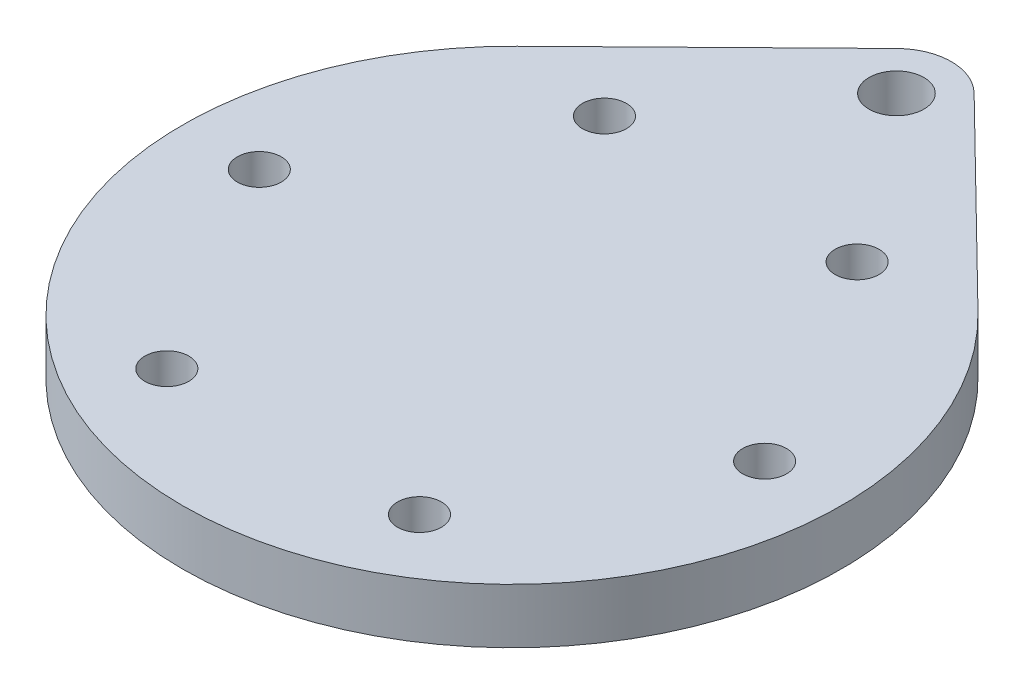
ISO-10303-21;
HEADER;
FILE_DESCRIPTION(('STEP AP214'),'2;1');
FILE_NAME('part.step','',(''),(''),'','','');
FILE_SCHEMA(('AUTOMOTIVE_DESIGN { 1 0 10303 214 1 1 1 1 }'));
ENDSEC;
DATA;
#1=APPLICATION_CONTEXT('core data for automotive mechanical design processes');
#2=APPLICATION_PROTOCOL_DEFINITION('international standard','automotive_design',2000,#1);
#3=PRODUCT_CONTEXT('',#1,'mechanical');
#4=PRODUCT('Part','Part','',(#3));
#5=PRODUCT_RELATED_PRODUCT_CATEGORY('part','',(#4));
#6=PRODUCT_DEFINITION_FORMATION('','',#4);
#7=PRODUCT_DEFINITION_CONTEXT('part definition',#1,'design');
#8=PRODUCT_DEFINITION('design','',#6,#7);
#9=PRODUCT_DEFINITION_SHAPE('','',#8);
#10=(LENGTH_UNIT() NAMED_UNIT(*) SI_UNIT(.MILLI.,.METRE.));
#11=(NAMED_UNIT(*) PLANE_ANGLE_UNIT() SI_UNIT($,.RADIAN.));
#12=(NAMED_UNIT(*) SI_UNIT($,.STERADIAN.) SOLID_ANGLE_UNIT());
#13=UNCERTAINTY_MEASURE_WITH_UNIT(LENGTH_MEASURE(1.E-05),#10,'distance_accuracy_value','');
#14=(GEOMETRIC_REPRESENTATION_CONTEXT(3) GLOBAL_UNCERTAINTY_ASSIGNED_CONTEXT((#13)) GLOBAL_UNIT_ASSIGNED_CONTEXT((#10,
#11,#12)) REPRESENTATION_CONTEXT('',''));
#15=CARTESIAN_POINT('',(0.,0.,0.));
#16=DIRECTION('',(0.,0.,1.));
#17=DIRECTION('',(1.,0.,0.));
#18=AXIS2_PLACEMENT_3D('',#15,#16,#17);
#19=CARTESIAN_POINT('',(0.,5.,0.));
#20=DIRECTION('',(0.,-1.,0.));
#21=DIRECTION('',(0.,0.,-1.));
#22=AXIS2_PLACEMENT_3D('',#19,#20,#21);
#23=CYLINDRICAL_SURFACE('',#22,30.);
#24=CARTESIAN_POINT('',(0.,0.,0.));
#25=DIRECTION('',(0.,1.,0.));
#26=DIRECTION('',(0.,0.,1.));
#27=AXIS2_PLACEMENT_3D('',#24,#25,#26);
#28=CIRCLE('',#27,30.);
#29=CARTESIAN_POINT('',(-20.995626366713,0.,-21.4285714285714));
#30=VERTEX_POINT('',#29);
#31=CARTESIAN_POINT('',(20.995626366713,0.,-21.4285714285714));
#32=VERTEX_POINT('',#31);
#33=EDGE_CURVE('E123',#30,#32,#28,.T.);
#34=ORIENTED_EDGE('',*,*,#33,.T.);
#35=DIRECTION('',(0.,-1.,0.));
#36=VECTOR('',#35,1.);
#37=CARTESIAN_POINT('',(20.995626366713,5.,-21.4285714285714));
#38=LINE('',#37,#36);
#39=CARTESIAN_POINT('',(20.995626366713,5.,-21.4285714285714));
#40=VERTEX_POINT('',#39);
#41=EDGE_CURVE('E11',#40,#32,#38,.T.);
#42=ORIENTED_EDGE('',*,*,#41,.F.);
#43=CARTESIAN_POINT('',(0.,5.,0.));
#44=DIRECTION('',(0.,1.,0.));
#45=DIRECTION('',(0.,0.,1.));
#46=AXIS2_PLACEMENT_3D('',#43,#44,#45);
#47=CIRCLE('',#46,30.);
#48=CARTESIAN_POINT('',(-20.995626366713,5.,-21.4285714285714));
#49=VERTEX_POINT('',#48);
#50=EDGE_CURVE('E78',#49,#40,#47,.T.);
#51=ORIENTED_EDGE('',*,*,#50,.F.);
#52=DIRECTION('',(0.,-1.,0.));
#53=VECTOR('',#52,1.);
#54=CARTESIAN_POINT('',(-20.995626366713,5.,-21.4285714285714));
#55=LINE('',#54,#53);
#56=EDGE_CURVE('E104',#49,#30,#55,.T.);
#57=ORIENTED_EDGE('',*,*,#56,.T.);
#58=EDGE_LOOP('',(#34,#42,#51,#57));
#59=FACE_BOUND('',#58,.T.);
#60=ADVANCED_FACE('F35',(#59),#23,.T.);
#61=CARTESIAN_POINT('',(20.995626366713,5.,-21.4285714285714));
#62=DIRECTION('',(0.699854212223765,0.,-0.714285714285714));
#63=DIRECTION('',(-0.714285714285714,0.,-0.699854212223765));
#64=AXIS2_PLACEMENT_3D('',#61,#62,#63);
#65=PLANE('',#64);
#66=DIRECTION('',(0.714285714285714,0.,0.699854212223766));
#67=VECTOR('',#66,1.);
#68=CARTESIAN_POINT('',(20.995626366713,0.,-21.4285714285714));
#69=LINE('',#68,#67);
#70=CARTESIAN_POINT('',(3.49927106111883,0.,-38.5714285714286));
#71=VERTEX_POINT('',#70);
#72=EDGE_CURVE('E88',#71,#32,#69,.T.);
#73=ORIENTED_EDGE('',*,*,#72,.F.);
#74=DIRECTION('',(0.,-1.,0.));
#75=VECTOR('',#74,1.);
#76=CARTESIAN_POINT('',(3.49927106111883,5.,-38.5714285714286));
#77=LINE('',#76,#75);
#78=CARTESIAN_POINT('',(3.49927106111883,5.,-38.5714285714286));
#79=VERTEX_POINT('',#78);
#80=EDGE_CURVE('E44',#79,#71,#77,.T.);
#81=ORIENTED_EDGE('',*,*,#80,.F.);
#82=DIRECTION('',(0.714285714285714,0.,0.699854212223766));
#83=VECTOR('',#82,1.);
#84=CARTESIAN_POINT('',(20.995626366713,5.,-21.4285714285714));
#85=LINE('',#84,#83);
#86=EDGE_CURVE('E86',#79,#40,#85,.T.);
#87=ORIENTED_EDGE('',*,*,#86,.T.);
#88=ORIENTED_EDGE('',*,*,#41,.T.);
#89=EDGE_LOOP('',(#73,#81,#87,#88));
#90=FACE_BOUND('',#89,.T.);
#91=ADVANCED_FACE('F85',(#90),#65,.T.);
#92=CARTESIAN_POINT('',(0.,5.,-35.));
#93=DIRECTION('',(0.,-1.,0.));
#94=DIRECTION('',(0.,0.,-1.));
#95=AXIS2_PLACEMENT_3D('',#92,#93,#94);
#96=CYLINDRICAL_SURFACE('',#95,5.00000000000001);
#97=CARTESIAN_POINT('',(0.,0.,-35.));
#98=DIRECTION('',(0.,1.,0.));
#99=DIRECTION('',(0.,0.,1.));
#100=AXIS2_PLACEMENT_3D('',#97,#98,#99);
#101=CIRCLE('',#100,5.00000000000001);
#102=CARTESIAN_POINT('',(-3.49927106111883,0.,-38.5714285714286));
#103=VERTEX_POINT('',#102);
#104=EDGE_CURVE('E67',#71,#103,#101,.T.);
#105=ORIENTED_EDGE('',*,*,#104,.T.);
#106=DIRECTION('',(0.,-1.,0.));
#107=VECTOR('',#106,1.);
#108=CARTESIAN_POINT('',(-3.49927106111883,5.,-38.5714285714286));
#109=LINE('',#108,#107);
#110=CARTESIAN_POINT('',(-3.49927106111883,5.,-38.5714285714286));
#111=VERTEX_POINT('',#110);
#112=EDGE_CURVE('E89',#111,#103,#109,.T.);
#113=ORIENTED_EDGE('',*,*,#112,.F.);
#114=CARTESIAN_POINT('',(0.,5.,-35.));
#115=DIRECTION('',(0.,1.,0.));
#116=DIRECTION('',(0.,0.,1.));
#117=AXIS2_PLACEMENT_3D('',#114,#115,#116);
#118=CIRCLE('',#117,5.00000000000001);
#119=EDGE_CURVE('E90',#79,#111,#118,.T.);
#120=ORIENTED_EDGE('',*,*,#119,.F.);
#121=ORIENTED_EDGE('',*,*,#80,.T.);
#122=EDGE_LOOP('',(#105,#113,#120,#121));
#123=FACE_BOUND('',#122,.T.);
#124=ADVANCED_FACE('F91',(#123),#96,.T.);
#125=CARTESIAN_POINT('',(-20.995626366713,5.,-21.4285714285714));
#126=DIRECTION('',(0.699854212223765,0.,0.714285714285714));
#127=DIRECTION('',(0.714285714285714,0.,-0.699854212223765));
#128=AXIS2_PLACEMENT_3D('',#125,#126,#127);
#129=PLANE('',#128);
#130=DIRECTION('',(-0.714285714285714,0.,0.699854212223765));
#131=VECTOR('',#130,1.);
#132=CARTESIAN_POINT('',(-20.995626366713,0.,-21.4285714285714));
#133=LINE('',#132,#131);
#134=EDGE_CURVE('E73',#103,#30,#133,.T.);
#135=ORIENTED_EDGE('',*,*,#134,.T.);
#136=ORIENTED_EDGE('',*,*,#56,.F.);
#137=DIRECTION('',(-0.714285714285714,0.,0.699854212223765));
#138=VECTOR('',#137,1.);
#139=CARTESIAN_POINT('',(-20.995626366713,5.,-21.4285714285714));
#140=LINE('',#139,#138);
#141=EDGE_CURVE('E52',#111,#49,#140,.T.);
#142=ORIENTED_EDGE('',*,*,#141,.F.);
#143=ORIENTED_EDGE('',*,*,#112,.T.);
#144=EDGE_LOOP('',(#135,#136,#142,#143));
#145=FACE_BOUND('',#144,.T.);
#146=ADVANCED_FACE('F134',(#145),#129,.F.);
#147=CARTESIAN_POINT('',(23.,5.,0.));
#148=DIRECTION('',(0.,-1.,0.));
#149=DIRECTION('',(0.,0.,-1.));
#150=AXIS2_PLACEMENT_3D('',#147,#148,#149);
#151=CYLINDRICAL_SURFACE('',#150,2.);
#152=CARTESIAN_POINT('',(23.,5.,0.));
#153=DIRECTION('',(0.,1.,0.));
#154=DIRECTION('',(0.,0.,1.));
#155=AXIS2_PLACEMENT_3D('',#152,#153,#154);
#156=CIRCLE('',#155,2.);
#157=CARTESIAN_POINT('',(23.,5.,2.));
#158=VERTEX_POINT('',#157);
#159=EDGE_CURVE('E96',#158,#158,#156,.T.);
#160=ORIENTED_EDGE('',*,*,#159,.T.);
#161=EDGE_LOOP('',(#160));
#162=FACE_BOUND('',#161,.T.);
#163=CARTESIAN_POINT('',(23.,0.,0.));
#164=DIRECTION('',(0.,1.,0.));
#165=DIRECTION('',(0.,0.,1.));
#166=AXIS2_PLACEMENT_3D('',#163,#164,#165);
#167=CIRCLE('',#166,2.);
#168=CARTESIAN_POINT('',(23.,0.,2.));
#169=VERTEX_POINT('',#168);
#170=EDGE_CURVE('E120',#169,#169,#167,.T.);
#171=ORIENTED_EDGE('',*,*,#170,.F.);
#172=EDGE_LOOP('',(#171));
#173=FACE_BOUND('',#172,.T.);
#174=ADVANCED_FACE('F148',(#162,#173),#151,.F.);
#175=CARTESIAN_POINT('',(11.5,5.,19.9185842870421));
#176=DIRECTION('',(0.,-1.,0.));
#177=DIRECTION('',(0.,0.,-1.));
#178=AXIS2_PLACEMENT_3D('',#175,#176,#177);
#179=CYLINDRICAL_SURFACE('',#178,2.);
#180=CARTESIAN_POINT('',(11.5,5.,19.9185842870421));
#181=DIRECTION('',(0.,1.,0.));
#182=DIRECTION('',(0.,0.,1.));
#183=AXIS2_PLACEMENT_3D('',#180,#181,#182);
#184=CIRCLE('',#183,2.);
#185=CARTESIAN_POINT('',(11.5,5.,21.9185842870421));
#186=VERTEX_POINT('',#185);
#187=EDGE_CURVE('E313',#186,#186,#184,.T.);
#188=ORIENTED_EDGE('',*,*,#187,.T.);
#189=EDGE_LOOP('',(#188));
#190=FACE_BOUND('',#189,.T.);
#191=CARTESIAN_POINT('',(11.5,0.,19.9185842870421));
#192=DIRECTION('',(0.,1.,0.));
#193=DIRECTION('',(0.,0.,1.));
#194=AXIS2_PLACEMENT_3D('',#191,#192,#193);
#195=CIRCLE('',#194,2.);
#196=CARTESIAN_POINT('',(11.5,0.,21.9185842870421));
#197=VERTEX_POINT('',#196);
#198=EDGE_CURVE('E117',#197,#197,#195,.T.);
#199=ORIENTED_EDGE('',*,*,#198,.F.);
#200=EDGE_LOOP('',(#199));
#201=FACE_BOUND('',#200,.T.);
#202=ADVANCED_FACE('F151',(#190,#201),#179,.F.);
#203=CARTESIAN_POINT('',(-11.5000000000001,5.,19.918584287042));
#204=DIRECTION('',(0.,-1.,0.));
#205=DIRECTION('',(0.,0.,-1.));
#206=AXIS2_PLACEMENT_3D('',#203,#204,#205);
#207=CYLINDRICAL_SURFACE('',#206,2.00000000000001);
#208=CARTESIAN_POINT('',(-11.5000000000001,5.,19.918584287042));
#209=DIRECTION('',(0.,1.,0.));
#210=DIRECTION('',(0.,0.,1.));
#211=AXIS2_PLACEMENT_3D('',#208,#209,#210);
#212=CIRCLE('',#211,2.00000000000001);
#213=CARTESIAN_POINT('',(-11.5000000000001,5.,21.9185842870421));
#214=VERTEX_POINT('',#213);
#215=EDGE_CURVE('E309',#214,#214,#212,.T.);
#216=ORIENTED_EDGE('',*,*,#215,.T.);
#217=EDGE_LOOP('',(#216));
#218=FACE_BOUND('',#217,.T.);
#219=CARTESIAN_POINT('',(-11.5000000000001,0.,19.918584287042));
#220=DIRECTION('',(0.,1.,0.));
#221=DIRECTION('',(0.,0.,1.));
#222=AXIS2_PLACEMENT_3D('',#219,#220,#221);
#223=CIRCLE('',#222,2.00000000000001);
#224=CARTESIAN_POINT('',(-11.5000000000001,0.,21.9185842870421));
#225=VERTEX_POINT('',#224);
#226=EDGE_CURVE('E114',#225,#225,#223,.T.);
#227=ORIENTED_EDGE('',*,*,#226,.F.);
#228=EDGE_LOOP('',(#227));
#229=FACE_BOUND('',#228,.T.);
#230=ADVANCED_FACE('F155',(#218,#229),#207,.F.);
#231=CARTESIAN_POINT('',(-23.,5.,-1.60608141586784E-13));
#232=DIRECTION('',(0.,-1.,0.));
#233=DIRECTION('',(0.,0.,-1.));
#234=AXIS2_PLACEMENT_3D('',#231,#232,#233);
#235=CYLINDRICAL_SURFACE('',#234,2.);
#236=CARTESIAN_POINT('',(-23.,5.,-1.60608141586784E-13));
#237=DIRECTION('',(0.,1.,0.));
#238=DIRECTION('',(0.,0.,1.));
#239=AXIS2_PLACEMENT_3D('',#236,#237,#238);
#240=CIRCLE('',#239,2.);
#241=CARTESIAN_POINT('',(-23.,5.,1.99999999999984));
#242=VERTEX_POINT('',#241);
#243=EDGE_CURVE('E305',#242,#242,#240,.T.);
#244=ORIENTED_EDGE('',*,*,#243,.T.);
#245=EDGE_LOOP('',(#244));
#246=FACE_BOUND('',#245,.T.);
#247=CARTESIAN_POINT('',(-23.,0.,-1.60608141586784E-13));
#248=DIRECTION('',(0.,1.,0.));
#249=DIRECTION('',(0.,0.,1.));
#250=AXIS2_PLACEMENT_3D('',#247,#248,#249);
#251=CIRCLE('',#250,2.);
#252=CARTESIAN_POINT('',(-23.,0.,1.99999999999984));
#253=VERTEX_POINT('',#252);
#254=EDGE_CURVE('E111',#253,#253,#251,.T.);
#255=ORIENTED_EDGE('',*,*,#254,.F.);
#256=EDGE_LOOP('',(#255));
#257=FACE_BOUND('',#256,.T.);
#258=ADVANCED_FACE('F159',(#246,#257),#235,.F.);
#259=CARTESIAN_POINT('',(-11.4999999999998,5.,-19.9185842870422));
#260=DIRECTION('',(0.,-1.,0.));
#261=DIRECTION('',(0.,0.,-1.));
#262=AXIS2_PLACEMENT_3D('',#259,#260,#261);
#263=CYLINDRICAL_SURFACE('',#262,2.);
#264=CARTESIAN_POINT('',(-11.4999999999998,5.,-19.9185842870422));
#265=DIRECTION('',(0.,1.,0.));
#266=DIRECTION('',(0.,0.,1.));
#267=AXIS2_PLACEMENT_3D('',#264,#265,#266);
#268=CIRCLE('',#267,2.);
#269=CARTESIAN_POINT('',(-11.4999999999998,5.,-17.9185842870422));
#270=VERTEX_POINT('',#269);
#271=EDGE_CURVE('E174',#270,#270,#268,.T.);
#272=ORIENTED_EDGE('',*,*,#271,.T.);
#273=EDGE_LOOP('',(#272));
#274=FACE_BOUND('',#273,.T.);
#275=CARTESIAN_POINT('',(-11.4999999999998,0.,-19.9185842870422));
#276=DIRECTION('',(0.,1.,0.));
#277=DIRECTION('',(0.,0.,1.));
#278=AXIS2_PLACEMENT_3D('',#275,#276,#277);
#279=CIRCLE('',#278,2.);
#280=CARTESIAN_POINT('',(-11.4999999999998,0.,-17.9185842870422));
#281=VERTEX_POINT('',#280);
#282=EDGE_CURVE('E108',#281,#281,#279,.T.);
#283=ORIENTED_EDGE('',*,*,#282,.F.);
#284=EDGE_LOOP('',(#283));
#285=FACE_BOUND('',#284,.T.);
#286=ADVANCED_FACE('F162',(#274,#285),#263,.F.);
#287=CARTESIAN_POINT('',(11.5000000000002,5.,-19.918584287042));
#288=DIRECTION('',(0.,-1.,0.));
#289=DIRECTION('',(0.,0.,-1.));
#290=AXIS2_PLACEMENT_3D('',#287,#288,#289);
#291=CYLINDRICAL_SURFACE('',#290,2.);
#292=CARTESIAN_POINT('',(11.5000000000002,5.,-19.918584287042));
#293=DIRECTION('',(0.,1.,0.));
#294=DIRECTION('',(0.,0.,1.));
#295=AXIS2_PLACEMENT_3D('',#292,#293,#294);
#296=CIRCLE('',#295,2.);
#297=CARTESIAN_POINT('',(11.5000000000002,5.,-17.918584287042));
#298=VERTEX_POINT('',#297);
#299=EDGE_CURVE('E132',#298,#298,#296,.T.);
#300=ORIENTED_EDGE('',*,*,#299,.T.);
#301=EDGE_LOOP('',(#300));
#302=FACE_BOUND('',#301,.T.);
#303=CARTESIAN_POINT('',(11.5000000000002,0.,-19.918584287042));
#304=DIRECTION('',(0.,1.,0.));
#305=DIRECTION('',(0.,0.,1.));
#306=AXIS2_PLACEMENT_3D('',#303,#304,#305);
#307=CIRCLE('',#306,2.);
#308=CARTESIAN_POINT('',(11.5000000000002,0.,-17.918584287042));
#309=VERTEX_POINT('',#308);
#310=EDGE_CURVE('E105',#309,#309,#307,.T.);
#311=ORIENTED_EDGE('',*,*,#310,.F.);
#312=EDGE_LOOP('',(#311));
#313=FACE_BOUND('',#312,.T.);
#314=ADVANCED_FACE('F37',(#302,#313),#291,.F.);
#315=CARTESIAN_POINT('',(0.,5.,-35.));
#316=DIRECTION('',(0.,-1.,0.));
#317=DIRECTION('',(0.,0.,-1.));
#318=AXIS2_PLACEMENT_3D('',#315,#316,#317);
#319=CYLINDRICAL_SURFACE('',#318,2.5);
#320=CARTESIAN_POINT('',(0.,5.,-35.));
#321=DIRECTION('',(0.,1.,0.));
#322=DIRECTION('',(0.,0.,1.));
#323=AXIS2_PLACEMENT_3D('',#320,#321,#322);
#324=CIRCLE('',#323,2.5);
#325=CARTESIAN_POINT('',(0.,5.,-32.5));
#326=VERTEX_POINT('',#325);
#327=EDGE_CURVE('E101',#326,#326,#324,.T.);
#328=ORIENTED_EDGE('',*,*,#327,.T.);
#329=EDGE_LOOP('',(#328));
#330=FACE_BOUND('',#329,.T.);
#331=CARTESIAN_POINT('',(0.,0.,-35.));
#332=DIRECTION('',(0.,1.,0.));
#333=DIRECTION('',(0.,0.,1.));
#334=AXIS2_PLACEMENT_3D('',#331,#332,#333);
#335=CIRCLE('',#334,2.5);
#336=CARTESIAN_POINT('',(0.,0.,-32.5));
#337=VERTEX_POINT('',#336);
#338=EDGE_CURVE('E129',#337,#337,#335,.T.);
#339=ORIENTED_EDGE('',*,*,#338,.F.);
#340=EDGE_LOOP('',(#339));
#341=FACE_BOUND('',#340,.T.);
#342=ADVANCED_FACE('F169',(#330,#341),#319,.F.);
#343=CARTESIAN_POINT('',(0.,5.,0.));
#344=DIRECTION('',(0.,1.,0.));
#345=DIRECTION('',(0.,0.,1.));
#346=AXIS2_PLACEMENT_3D('',#343,#344,#345);
#347=PLANE('',#346);
#348=ORIENTED_EDGE('',*,*,#299,.F.);
#349=EDGE_LOOP('',(#348));
#350=FACE_BOUND('',#349,.T.);
#351=ORIENTED_EDGE('',*,*,#271,.F.);
#352=EDGE_LOOP('',(#351));
#353=FACE_BOUND('',#352,.T.);
#354=ORIENTED_EDGE('',*,*,#243,.F.);
#355=EDGE_LOOP('',(#354));
#356=FACE_BOUND('',#355,.T.);
#357=ORIENTED_EDGE('',*,*,#215,.F.);
#358=EDGE_LOOP('',(#357));
#359=FACE_BOUND('',#358,.T.);
#360=ORIENTED_EDGE('',*,*,#187,.F.);
#361=EDGE_LOOP('',(#360));
#362=FACE_BOUND('',#361,.T.);
#363=ORIENTED_EDGE('',*,*,#159,.F.);
#364=EDGE_LOOP('',(#363));
#365=FACE_BOUND('',#364,.T.);
#366=ORIENTED_EDGE('',*,*,#50,.T.);
#367=ORIENTED_EDGE('',*,*,#86,.F.);
#368=ORIENTED_EDGE('',*,*,#119,.T.);
#369=ORIENTED_EDGE('',*,*,#141,.T.);
#370=EDGE_LOOP('',(#366,#367,#368,#369));
#371=FACE_BOUND('',#370,.T.);
#372=ORIENTED_EDGE('',*,*,#327,.F.);
#373=EDGE_LOOP('',(#372));
#374=FACE_BOUND('',#373,.T.);
#375=ADVANCED_FACE('F93',(#350,#353,#356,#359,#362,#365,#371,#374),#347,.T.);
#376=CARTESIAN_POINT('',(0.,0.,0.));
#377=DIRECTION('',(0.,1.,0.));
#378=DIRECTION('',(0.,0.,1.));
#379=AXIS2_PLACEMENT_3D('',#376,#377,#378);
#380=PLANE('',#379);
#381=ORIENTED_EDGE('',*,*,#310,.T.);
#382=EDGE_LOOP('',(#381));
#383=FACE_BOUND('',#382,.T.);
#384=ORIENTED_EDGE('',*,*,#282,.T.);
#385=EDGE_LOOP('',(#384));
#386=FACE_BOUND('',#385,.T.);
#387=ORIENTED_EDGE('',*,*,#254,.T.);
#388=EDGE_LOOP('',(#387));
#389=FACE_BOUND('',#388,.T.);
#390=ORIENTED_EDGE('',*,*,#226,.T.);
#391=EDGE_LOOP('',(#390));
#392=FACE_BOUND('',#391,.T.);
#393=ORIENTED_EDGE('',*,*,#198,.T.);
#394=EDGE_LOOP('',(#393));
#395=FACE_BOUND('',#394,.T.);
#396=ORIENTED_EDGE('',*,*,#170,.T.);
#397=EDGE_LOOP('',(#396));
#398=FACE_BOUND('',#397,.T.);
#399=ORIENTED_EDGE('',*,*,#33,.F.);
#400=ORIENTED_EDGE('',*,*,#134,.F.);
#401=ORIENTED_EDGE('',*,*,#104,.F.);
#402=ORIENTED_EDGE('',*,*,#72,.T.);
#403=EDGE_LOOP('',(#399,#400,#401,#402));
#404=FACE_BOUND('',#403,.T.);
#405=ORIENTED_EDGE('',*,*,#338,.T.);
#406=EDGE_LOOP('',(#405));
#407=FACE_BOUND('',#406,.T.);
#408=ADVANCED_FACE('F137',(#383,#386,#389,#392,#395,#398,#404,#407),#380,.F.);
#409=CLOSED_SHELL('',(#60,#91,#124,#146,#174,#202,#230,#258,#286,#314,#342,#375,#408));
#410=MANIFOLD_SOLID_BREP('B2',#409);
#411=ADVANCED_BREP_SHAPE_REPRESENTATION('',(#18,#410),#14);
#412=SHAPE_DEFINITION_REPRESENTATION(#9,#411);
ENDSEC;
END-ISO-10303-21;
